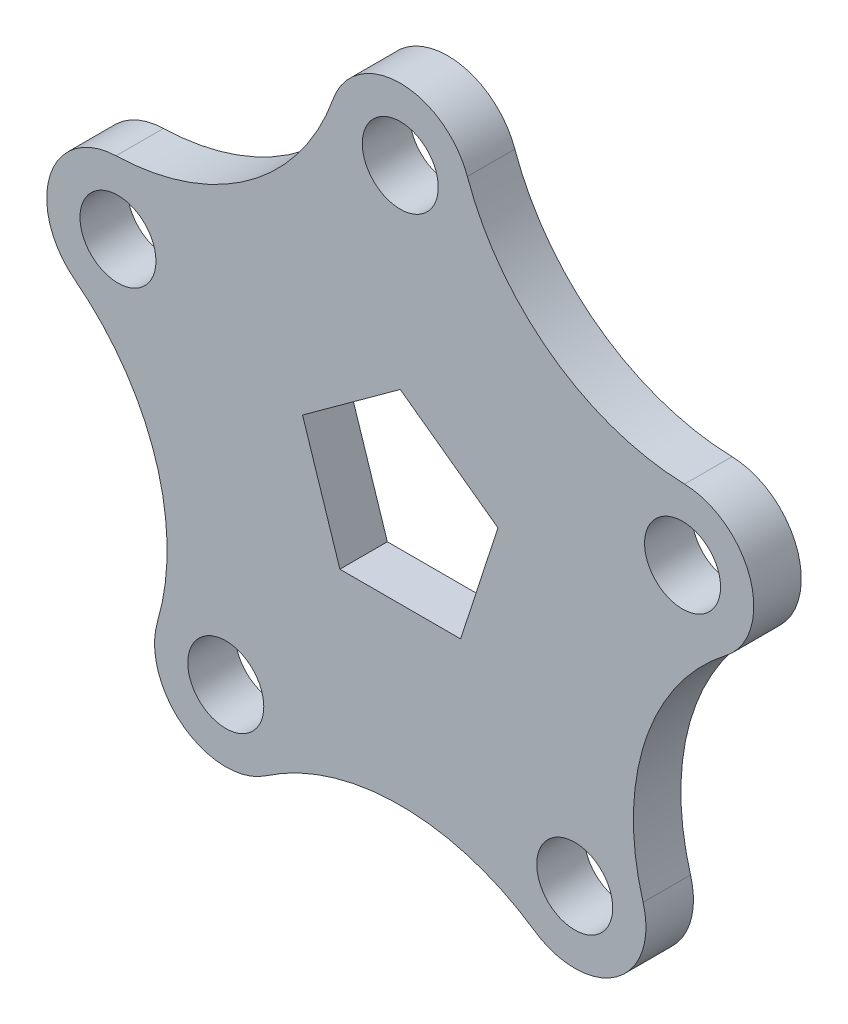
ISO-10303-21;
HEADER;
FILE_DESCRIPTION(('STEP AP214'),'2;1');
FILE_NAME('part.step','',(''),(''),'','','');
FILE_SCHEMA(('AUTOMOTIVE_DESIGN { 1 0 10303 214 1 1 1 1 }'));
ENDSEC;
DATA;
#1=APPLICATION_CONTEXT('core data for automotive mechanical design processes');
#2=APPLICATION_PROTOCOL_DEFINITION('international standard','automotive_design',2000,#1);
#3=PRODUCT_CONTEXT('',#1,'mechanical');
#4=PRODUCT('Part','Part','',(#3));
#5=PRODUCT_RELATED_PRODUCT_CATEGORY('part','',(#4));
#6=PRODUCT_DEFINITION_FORMATION('','',#4);
#7=PRODUCT_DEFINITION_CONTEXT('part definition',#1,'design');
#8=PRODUCT_DEFINITION('design','',#6,#7);
#9=PRODUCT_DEFINITION_SHAPE('','',#8);
#10=(LENGTH_UNIT() NAMED_UNIT(*) SI_UNIT(.MILLI.,.METRE.));
#11=(NAMED_UNIT(*) PLANE_ANGLE_UNIT() SI_UNIT($,.RADIAN.));
#12=(NAMED_UNIT(*) SI_UNIT($,.STERADIAN.) SOLID_ANGLE_UNIT());
#13=UNCERTAINTY_MEASURE_WITH_UNIT(LENGTH_MEASURE(1.E-05),#10,'distance_accuracy_value','');
#14=(GEOMETRIC_REPRESENTATION_CONTEXT(3) GLOBAL_UNCERTAINTY_ASSIGNED_CONTEXT((#13)) GLOBAL_UNIT_ASSIGNED_CONTEXT((#10,
#11,#12)) REPRESENTATION_CONTEXT('',''));
#15=CARTESIAN_POINT('',(0.,0.,0.));
#16=DIRECTION('',(0.,0.,1.));
#17=DIRECTION('',(1.,0.,0.));
#18=AXIS2_PLACEMENT_3D('',#15,#16,#17);
#19=CARTESIAN_POINT('',(10.2862419151183,14.1577974015616,10.));
#20=DIRECTION('',(-0.587785252292473,-0.809016994374948,0.));
#21=DIRECTION('',(0.809016994374948,-0.587785252292473,0.));
#22=AXIS2_PLACEMENT_3D('',#19,#20,#21);
#23=PLANE('',#22);
#24=DIRECTION('',(-0.809016994374948,0.587785252292473,0.));
#25=VECTOR('',#24,1.);
#26=CARTESIAN_POINT('',(10.2862419151183,14.1577974015616,0.));
#27=LINE('',#26,#25);
#28=CARTESIAN_POINT('',(20.5724838302366,6.68440519687684,0.));
#29=VERTEX_POINT('',#28);
#30=CARTESIAN_POINT('',(0.,21.6311896062463,0.));
#31=VERTEX_POINT('',#30);
#32=EDGE_CURVE('E252',#29,#31,#27,.T.);
#33=ORIENTED_EDGE('',*,*,#32,.F.);
#34=DIRECTION('',(0.,0.,-1.));
#35=VECTOR('',#34,1.);
#36=CARTESIAN_POINT('',(20.5724838302366,6.68440519687684,10.));
#37=LINE('',#36,#35);
#38=CARTESIAN_POINT('',(20.5724838302366,6.68440519687684,10.));
#39=VERTEX_POINT('',#38);
#40=EDGE_CURVE('E11',#39,#29,#37,.T.);
#41=ORIENTED_EDGE('',*,*,#40,.F.);
#42=DIRECTION('',(-0.809016994374948,0.587785252292473,0.));
#43=VECTOR('',#42,1.);
#44=CARTESIAN_POINT('',(10.2862419151183,14.1577974015616,10.));
#45=LINE('',#44,#43);
#46=CARTESIAN_POINT('',(0.,21.6311896062463,10.));
#47=VERTEX_POINT('',#46);
#48=EDGE_CURVE('E399',#39,#47,#45,.T.);
#49=ORIENTED_EDGE('',*,*,#48,.T.);
#50=DIRECTION('',(0.,0.,-1.));
#51=VECTOR('',#50,1.);
#52=CARTESIAN_POINT('',(0.,21.6311896062463,10.));
#53=LINE('',#52,#51);
#54=EDGE_CURVE('E65',#47,#31,#53,.T.);
#55=ORIENTED_EDGE('',*,*,#54,.T.);
#56=EDGE_LOOP('',(#33,#41,#49,#55));
#57=FACE_BOUND('',#56,.T.);
#58=ADVANCED_FACE('F45',(#57),#23,.T.);
#59=CARTESIAN_POINT('',(16.6434890351652,-5.40779740156158,10.));
#60=DIRECTION('',(-0.951056516295154,0.309016994374948,0.));
#61=DIRECTION('',(-0.309016994374948,-0.951056516295154,0.));
#62=AXIS2_PLACEMENT_3D('',#59,#60,#61);
#63=PLANE('',#62);
#64=DIRECTION('',(0.309016994374948,0.951056516295154,0.));
#65=VECTOR('',#64,1.);
#66=CARTESIAN_POINT('',(16.6434890351652,-5.40779740156158,0.));
#67=LINE('',#66,#65);
#68=CARTESIAN_POINT('',(12.7144942400938,-17.5,0.));
#69=VERTEX_POINT('',#68);
#70=EDGE_CURVE('E255',#69,#29,#67,.T.);
#71=ORIENTED_EDGE('',*,*,#70,.F.);
#72=DIRECTION('',(0.,0.,-1.));
#73=VECTOR('',#72,1.);
#74=CARTESIAN_POINT('',(12.7144942400938,-17.5,10.));
#75=LINE('',#74,#73);
#76=CARTESIAN_POINT('',(12.7144942400938,-17.5,10.));
#77=VERTEX_POINT('',#76);
#78=EDGE_CURVE('E56',#77,#69,#75,.T.);
#79=ORIENTED_EDGE('',*,*,#78,.F.);
#80=DIRECTION('',(0.309016994374948,0.951056516295154,0.));
#81=VECTOR('',#80,1.);
#82=CARTESIAN_POINT('',(16.6434890351652,-5.40779740156158,10.));
#83=LINE('',#82,#81);
#84=EDGE_CURVE('E180',#77,#39,#83,.T.);
#85=ORIENTED_EDGE('',*,*,#84,.T.);
#86=ORIENTED_EDGE('',*,*,#40,.T.);
#87=EDGE_LOOP('',(#71,#79,#85,#86));
#88=FACE_BOUND('',#87,.T.);
#89=ADVANCED_FACE('F404',(#88),#63,.T.);
#90=CARTESIAN_POINT('',(0.,-17.5,10.));
#91=DIRECTION('',(0.,1.,0.));
#92=DIRECTION('',(-1.,0.,0.));
#93=AXIS2_PLACEMENT_3D('',#90,#91,#92);
#94=PLANE('',#93);
#95=DIRECTION('',(1.,0.,0.));
#96=VECTOR('',#95,1.);
#97=CARTESIAN_POINT('',(0.,-17.5,0.));
#98=LINE('',#97,#96);
#99=CARTESIAN_POINT('',(-12.7144942400938,-17.5,0.));
#100=VERTEX_POINT('',#99);
#101=EDGE_CURVE('E165',#100,#69,#98,.T.);
#102=ORIENTED_EDGE('',*,*,#101,.F.);
#103=DIRECTION('',(0.,0.,-1.));
#104=VECTOR('',#103,1.);
#105=CARTESIAN_POINT('',(-12.7144942400938,-17.5,10.));
#106=LINE('',#105,#104);
#107=CARTESIAN_POINT('',(-12.7144942400938,-17.5,10.));
#108=VERTEX_POINT('',#107);
#109=EDGE_CURVE('E160',#108,#100,#106,.T.);
#110=ORIENTED_EDGE('',*,*,#109,.F.);
#111=DIRECTION('',(1.,0.,0.));
#112=VECTOR('',#111,1.);
#113=CARTESIAN_POINT('',(0.,-17.5,10.));
#114=LINE('',#113,#112);
#115=EDGE_CURVE('E163',#108,#77,#114,.T.);
#116=ORIENTED_EDGE('',*,*,#115,.T.);
#117=ORIENTED_EDGE('',*,*,#78,.T.);
#118=EDGE_LOOP('',(#102,#110,#116,#117));
#119=FACE_BOUND('',#118,.T.);
#120=ADVANCED_FACE('F162',(#119),#94,.T.);
#121=CARTESIAN_POINT('',(-16.6434890351652,-5.40779740156159,10.));
#122=DIRECTION('',(0.951056516295154,0.309016994374948,0.));
#123=DIRECTION('',(-0.309016994374948,0.951056516295154,0.));
#124=AXIS2_PLACEMENT_3D('',#121,#122,#123);
#125=PLANE('',#124);
#126=DIRECTION('',(0.309016994374948,-0.951056516295154,0.));
#127=VECTOR('',#126,1.);
#128=CARTESIAN_POINT('',(-16.6434890351652,-5.40779740156159,0.));
#129=LINE('',#128,#127);
#130=CARTESIAN_POINT('',(-20.5724838302366,6.68440519687683,0.));
#131=VERTEX_POINT('',#130);
#132=EDGE_CURVE('E261',#131,#100,#129,.T.);
#133=ORIENTED_EDGE('',*,*,#132,.F.);
#134=DIRECTION('',(0.,0.,-1.));
#135=VECTOR('',#134,1.);
#136=CARTESIAN_POINT('',(-20.5724838302366,6.68440519687683,10.));
#137=LINE('',#136,#135);
#138=CARTESIAN_POINT('',(-20.5724838302366,6.68440519687683,10.));
#139=VERTEX_POINT('',#138);
#140=EDGE_CURVE('E111',#139,#131,#137,.T.);
#141=ORIENTED_EDGE('',*,*,#140,.F.);
#142=DIRECTION('',(0.309016994374948,-0.951056516295154,0.));
#143=VECTOR('',#142,1.);
#144=CARTESIAN_POINT('',(-16.6434890351652,-5.40779740156159,10.));
#145=LINE('',#144,#143);
#146=EDGE_CURVE('E178',#139,#108,#145,.T.);
#147=ORIENTED_EDGE('',*,*,#146,.T.);
#148=ORIENTED_EDGE('',*,*,#109,.T.);
#149=EDGE_LOOP('',(#133,#141,#147,#148));
#150=FACE_BOUND('',#149,.T.);
#151=ADVANCED_FACE('F183',(#150),#125,.T.);
#152=CARTESIAN_POINT('',(-61.2393120472351,84.288681923909,10.));
#153=DIRECTION('',(0.,0.,-1.));
#154=DIRECTION('',(-1.,0.,0.));
#155=AXIS2_PLACEMENT_3D('',#152,#153,#154);
#156=CYLINDRICAL_SURFACE('',#155,49.9999999999997);
#157=CARTESIAN_POINT('',(-61.2393120472351,84.288681923909,0.));
#158=DIRECTION('',(0.,0.,1.));
#159=DIRECTION('',(1.,0.,0.));
#160=AXIS2_PLACEMENT_3D('',#157,#158,#159);
#161=CIRCLE('',#160,49.9999999999997);
#162=CARTESIAN_POINT('',(-59.8560199097057,34.3078205581597,0.));
#163=VERTEX_POINT('',#162);
#164=CARTESIAN_POINT('',(-14.1321489339774,67.5281573670559,0.));
#165=VERTEX_POINT('',#164);
#166=EDGE_CURVE('E196',#163,#165,#161,.T.);
#167=ORIENTED_EDGE('',*,*,#166,.F.);
#168=DIRECTION('',(0.,0.,-1.));
#169=VECTOR('',#168,1.);
#170=CARTESIAN_POINT('',(-59.8560199097057,34.3078205581597,10.));
#171=LINE('',#170,#169);
#172=CARTESIAN_POINT('',(-59.8560199097057,34.3078205581597,10.));
#173=VERTEX_POINT('',#172);
#174=EDGE_CURVE('E49',#173,#163,#171,.T.);
#175=ORIENTED_EDGE('',*,*,#174,.F.);
#176=CARTESIAN_POINT('',(-61.2393120472351,84.288681923909,10.));
#177=DIRECTION('',(0.,0.,1.));
#178=DIRECTION('',(1.,0.,0.));
#179=AXIS2_PLACEMENT_3D('',#176,#177,#178);
#180=CIRCLE('',#179,49.9999999999997);
#181=CARTESIAN_POINT('',(-14.1321489339774,67.5281573670559,10.));
#182=VERTEX_POINT('',#181);
#183=EDGE_CURVE('E272',#173,#182,#180,.T.);
#184=ORIENTED_EDGE('',*,*,#183,.T.);
#185=DIRECTION('',(0.,0.,-1.));
#186=VECTOR('',#185,1.);
#187=CARTESIAN_POINT('',(-14.1321489339774,67.5281573670559,10.));
#188=LINE('',#187,#186);
#189=EDGE_CURVE('E195',#182,#165,#188,.T.);
#190=ORIENTED_EDGE('',*,*,#189,.T.);
#191=EDGE_LOOP('',(#167,#175,#184,#190));
#192=FACE_BOUND('',#191,.T.);
#193=ADVANCED_FACE('F47',(#192),#156,.F.);
#194=CARTESIAN_POINT('',(-59.4410322684469,19.3135621484349,10.));
#195=DIRECTION('',(0.,0.,-1.));
#196=DIRECTION('',(-1.,0.,0.));
#197=AXIS2_PLACEMENT_3D('',#194,#195,#196);
#198=CYLINDRICAL_SURFACE('',#197,15.);
#199=CARTESIAN_POINT('',(-59.4410322684469,19.3135621484349,0.));
#200=DIRECTION('',(0.,0.,1.));
#201=DIRECTION('',(1.,0.,0.));
#202=AXIS2_PLACEMENT_3D('',#199,#200,#201);
#203=CIRCLE('',#202,15.);
#204=CARTESIAN_POINT('',(-68.5901682849797,7.4268758923338,0.));
#205=VERTEX_POINT('',#204);
#206=EDGE_CURVE('E200',#163,#205,#203,.T.);
#207=ORIENTED_EDGE('',*,*,#206,.T.);
#208=DIRECTION('',(0.,0.,-1.));
#209=VECTOR('',#208,1.);
#210=CARTESIAN_POINT('',(-68.5901682849797,7.4268758923338,10.));
#211=LINE('',#210,#209);
#212=CARTESIAN_POINT('',(-68.5901682849797,7.4268758923338,10.));
#213=VERTEX_POINT('',#212);
#214=EDGE_CURVE('E301',#213,#205,#211,.T.);
#215=ORIENTED_EDGE('',*,*,#214,.F.);
#216=CARTESIAN_POINT('',(-59.4410322684469,19.3135621484349,10.));
#217=DIRECTION('',(0.,0.,1.));
#218=DIRECTION('',(1.,0.,0.));
#219=AXIS2_PLACEMENT_3D('',#216,#217,#218);
#220=CIRCLE('',#219,15.);
#221=EDGE_CURVE('E311',#173,#213,#220,.T.);
#222=ORIENTED_EDGE('',*,*,#221,.F.);
#223=ORIENTED_EDGE('',*,*,#174,.T.);
#224=EDGE_LOOP('',(#207,#215,#222,#223));
#225=FACE_BOUND('',#224,.T.);
#226=ADVANCED_FACE('F310',(#225),#198,.T.);
#227=CARTESIAN_POINT('',(-99.0872883400892,-32.1954116280032,10.));
#228=DIRECTION('',(0.,0.,-1.));
#229=DIRECTION('',(-1.,0.,0.));
#230=AXIS2_PLACEMENT_3D('',#227,#228,#229);
#231=CYLINDRICAL_SURFACE('',#230,50.0000000000001);
#232=CARTESIAN_POINT('',(-99.0872883400892,-32.1954116280032,0.));
#233=DIRECTION('',(0.,0.,1.));
#234=DIRECTION('',(1.,0.,0.));
#235=AXIS2_PLACEMENT_3D('',#232,#233,#234);
#236=CIRCLE('',#235,50.0000000000001);
#237=CARTESIAN_POINT('',(-51.1252036694668,-46.3247581821807,0.));
#238=VERTEX_POINT('',#237);
#239=EDGE_CURVE('E204',#238,#205,#236,.T.);
#240=ORIENTED_EDGE('',*,*,#239,.F.);
#241=DIRECTION('',(0.,0.,-1.));
#242=VECTOR('',#241,1.);
#243=CARTESIAN_POINT('',(-51.1252036694668,-46.3247581821807,10.));
#244=LINE('',#243,#242);
#245=CARTESIAN_POINT('',(-51.1252036694668,-46.3247581821807,10.));
#246=VERTEX_POINT('',#245);
#247=EDGE_CURVE('E299',#246,#238,#244,.T.);
#248=ORIENTED_EDGE('',*,*,#247,.F.);
#249=CARTESIAN_POINT('',(-99.0872883400892,-32.1954116280032,10.));
#250=DIRECTION('',(0.,0.,1.));
#251=DIRECTION('',(1.,0.,0.));
#252=AXIS2_PLACEMENT_3D('',#249,#250,#251);
#253=CIRCLE('',#252,50.0000000000001);
#254=EDGE_CURVE('E356',#246,#213,#253,.T.);
#255=ORIENTED_EDGE('',*,*,#254,.T.);
#256=ORIENTED_EDGE('',*,*,#214,.T.);
#257=EDGE_LOOP('',(#240,#248,#255,#256));
#258=FACE_BOUND('',#257,.T.);
#259=ADVANCED_FACE('F354',(#258),#231,.F.);
#260=CARTESIAN_POINT('',(-36.73657826828,-50.5635621484339,10.));
#261=DIRECTION('',(0.,0.,-1.));
#262=DIRECTION('',(-1.,0.,0.));
#263=AXIS2_PLACEMENT_3D('',#260,#261,#262);
#264=CYLINDRICAL_SURFACE('',#263,15.);
#265=CARTESIAN_POINT('',(-36.73657826828,-50.5635621484339,0.));
#266=DIRECTION('',(0.,0.,1.));
#267=DIRECTION('',(1.,0.,0.));
#268=AXIS2_PLACEMENT_3D('',#265,#266,#267);
#269=CIRCLE('',#268,15.);
#270=CARTESIAN_POINT('',(-28.2589063602156,-62.9380956353665,0.));
#271=VERTEX_POINT('',#270);
#272=EDGE_CURVE('E208',#238,#271,#269,.T.);
#273=ORIENTED_EDGE('',*,*,#272,.T.);
#274=DIRECTION('',(0.,0.,-1.));
#275=VECTOR('',#274,1.);
#276=CARTESIAN_POINT('',(-28.2589063602156,-62.9380956353665,10.));
#277=LINE('',#276,#275);
#278=CARTESIAN_POINT('',(-28.2589063602156,-62.9380956353665,10.));
#279=VERTEX_POINT('',#278);
#280=EDGE_CURVE('E296',#279,#271,#277,.T.);
#281=ORIENTED_EDGE('',*,*,#280,.F.);
#282=CARTESIAN_POINT('',(-36.73657826828,-50.5635621484339,10.));
#283=DIRECTION('',(0.,0.,1.));
#284=DIRECTION('',(1.,0.,0.));
#285=AXIS2_PLACEMENT_3D('',#282,#283,#284);
#286=CIRCLE('',#285,15.);
#287=EDGE_CURVE('E357',#246,#279,#286,.T.);
#288=ORIENTED_EDGE('',*,*,#287,.F.);
#289=ORIENTED_EDGE('',*,*,#247,.T.);
#290=EDGE_LOOP('',(#273,#281,#288,#289));
#291=FACE_BOUND('',#290,.T.);
#292=ADVANCED_FACE('F353',(#291),#264,.T.);
#293=CARTESIAN_POINT('',(-6.03683769639929E-13,-104.186540591808,10.));
#294=DIRECTION('',(0.,0.,-1.));
#295=DIRECTION('',(-1.,0.,0.));
#296=AXIS2_PLACEMENT_3D('',#293,#294,#295);
#297=CYLINDRICAL_SURFACE('',#296,50.0000000000001);
#298=CARTESIAN_POINT('',(-6.03683769639929E-13,-104.186540591808,0.));
#299=DIRECTION('',(0.,0.,1.));
#300=DIRECTION('',(1.,0.,0.));
#301=AXIS2_PLACEMENT_3D('',#298,#299,#300);
#302=CIRCLE('',#301,50.0000000000001);
#303=CARTESIAN_POINT('',(28.2589063602147,-62.9380956353669,0.));
#304=VERTEX_POINT('',#303);
#305=EDGE_CURVE('E212',#304,#271,#302,.T.);
#306=ORIENTED_EDGE('',*,*,#305,.F.);
#307=DIRECTION('',(0.,0.,-1.));
#308=VECTOR('',#307,1.);
#309=CARTESIAN_POINT('',(28.2589063602147,-62.9380956353669,10.));
#310=LINE('',#309,#308);
#311=CARTESIAN_POINT('',(28.2589063602147,-62.9380956353669,10.));
#312=VERTEX_POINT('',#311);
#313=EDGE_CURVE('E293',#312,#304,#310,.T.);
#314=ORIENTED_EDGE('',*,*,#313,.F.);
#315=CARTESIAN_POINT('',(-6.03683769639929E-13,-104.186540591808,10.));
#316=DIRECTION('',(0.,0.,1.));
#317=DIRECTION('',(1.,0.,0.));
#318=AXIS2_PLACEMENT_3D('',#315,#316,#317);
#319=CIRCLE('',#318,50.0000000000001);
#320=EDGE_CURVE('E350',#312,#279,#319,.T.);
#321=ORIENTED_EDGE('',*,*,#320,.T.);
#322=ORIENTED_EDGE('',*,*,#280,.T.);
#323=EDGE_LOOP('',(#306,#314,#321,#322));
#324=FACE_BOUND('',#323,.T.);
#325=ADVANCED_FACE('F346',(#324),#297,.F.);
#326=CARTESIAN_POINT('',(36.7365782682793,-50.5635621484344,10.));
#327=DIRECTION('',(0.,0.,-1.));
#328=DIRECTION('',(-1.,0.,0.));
#329=AXIS2_PLACEMENT_3D('',#326,#327,#328);
#330=CYLINDRICAL_SURFACE('',#329,15.);
#331=CARTESIAN_POINT('',(36.7365782682793,-50.5635621484344,0.));
#332=DIRECTION('',(0.,0.,1.));
#333=DIRECTION('',(1.,0.,0.));
#334=AXIS2_PLACEMENT_3D('',#331,#332,#333);
#335=CIRCLE('',#334,15.);
#336=CARTESIAN_POINT('',(51.1252036694661,-46.3247581821813,0.));
#337=VERTEX_POINT('',#336);
#338=EDGE_CURVE('E216',#304,#337,#335,.T.);
#339=ORIENTED_EDGE('',*,*,#338,.T.);
#340=DIRECTION('',(0.,0.,-1.));
#341=VECTOR('',#340,1.);
#342=CARTESIAN_POINT('',(51.1252036694661,-46.3247581821813,10.));
#343=LINE('',#342,#341);
#344=CARTESIAN_POINT('',(51.1252036694661,-46.3247581821813,10.));
#345=VERTEX_POINT('',#344);
#346=EDGE_CURVE('E290',#345,#337,#343,.T.);
#347=ORIENTED_EDGE('',*,*,#346,.F.);
#348=CARTESIAN_POINT('',(36.7365782682793,-50.5635621484344,10.));
#349=DIRECTION('',(0.,0.,1.));
#350=DIRECTION('',(1.,0.,0.));
#351=AXIS2_PLACEMENT_3D('',#348,#349,#350);
#352=CIRCLE('',#351,15.);
#353=EDGE_CURVE('E370',#312,#345,#352,.T.);
#354=ORIENTED_EDGE('',*,*,#353,.F.);
#355=ORIENTED_EDGE('',*,*,#313,.T.);
#356=EDGE_LOOP('',(#339,#347,#354,#355));
#357=FACE_BOUND('',#356,.T.);
#358=ADVANCED_FACE('F343',(#357),#330,.T.);
#359=CARTESIAN_POINT('',(99.0872883400888,-32.1954116280044,10.));
#360=DIRECTION('',(0.,0.,-1.));
#361=DIRECTION('',(-1.,0.,0.));
#362=AXIS2_PLACEMENT_3D('',#359,#360,#361);
#363=CYLINDRICAL_SURFACE('',#362,50.0000000000001);
#364=CARTESIAN_POINT('',(99.0872883400888,-32.1954116280044,0.));
#365=DIRECTION('',(0.,0.,1.));
#366=DIRECTION('',(1.,0.,0.));
#367=AXIS2_PLACEMENT_3D('',#364,#365,#366);
#368=CIRCLE('',#367,50.0000000000001);
#369=CARTESIAN_POINT('',(68.5901682849799,7.42687589233287,0.));
#370=VERTEX_POINT('',#369);
#371=EDGE_CURVE('E220',#370,#337,#368,.T.);
#372=ORIENTED_EDGE('',*,*,#371,.F.);
#373=DIRECTION('',(0.,0.,-1.));
#374=VECTOR('',#373,1.);
#375=CARTESIAN_POINT('',(68.5901682849799,7.42687589233287,10.));
#376=LINE('',#375,#374);
#377=CARTESIAN_POINT('',(68.5901682849799,7.42687589233287,10.));
#378=VERTEX_POINT('',#377);
#379=EDGE_CURVE('E287',#378,#370,#376,.T.);
#380=ORIENTED_EDGE('',*,*,#379,.F.);
#381=CARTESIAN_POINT('',(99.0872883400888,-32.1954116280044,10.));
#382=DIRECTION('',(0.,0.,1.));
#383=DIRECTION('',(1.,0.,0.));
#384=AXIS2_PLACEMENT_3D('',#381,#382,#383);
#385=CIRCLE('',#384,50.0000000000001);
#386=EDGE_CURVE('E340',#378,#345,#385,.T.);
#387=ORIENTED_EDGE('',*,*,#386,.T.);
#388=ORIENTED_EDGE('',*,*,#346,.T.);
#389=EDGE_LOOP('',(#372,#380,#387,#388));
#390=FACE_BOUND('',#389,.T.);
#391=ADVANCED_FACE('F336',(#390),#363,.F.);
#392=CARTESIAN_POINT('',(59.4410322684472,19.313562148434,10.));
#393=DIRECTION('',(0.,0.,-1.));
#394=DIRECTION('',(-1.,0.,0.));
#395=AXIS2_PLACEMENT_3D('',#392,#393,#394);
#396=CYLINDRICAL_SURFACE('',#395,15.);
#397=CARTESIAN_POINT('',(59.4410322684472,19.313562148434,0.));
#398=DIRECTION('',(0.,0.,1.));
#399=DIRECTION('',(1.,0.,0.));
#400=AXIS2_PLACEMENT_3D('',#397,#398,#399);
#401=CIRCLE('',#400,15.);
#402=CARTESIAN_POINT('',(59.8560199097061,34.3078205581589,0.));
#403=VERTEX_POINT('',#402);
#404=EDGE_CURVE('E224',#370,#403,#401,.T.);
#405=ORIENTED_EDGE('',*,*,#404,.T.);
#406=DIRECTION('',(0.,0.,-1.));
#407=VECTOR('',#406,1.);
#408=CARTESIAN_POINT('',(59.8560199097061,34.3078205581589,10.));
#409=LINE('',#408,#407);
#410=CARTESIAN_POINT('',(59.8560199097061,34.3078205581589,10.));
#411=VERTEX_POINT('',#410);
#412=EDGE_CURVE('E284',#411,#403,#409,.T.);
#413=ORIENTED_EDGE('',*,*,#412,.F.);
#414=CARTESIAN_POINT('',(59.4410322684472,19.313562148434,10.));
#415=DIRECTION('',(0.,0.,1.));
#416=DIRECTION('',(1.,0.,0.));
#417=AXIS2_PLACEMENT_3D('',#414,#415,#416);
#418=CIRCLE('',#417,15.);
#419=EDGE_CURVE('E375',#378,#411,#418,.T.);
#420=ORIENTED_EDGE('',*,*,#419,.F.);
#421=ORIENTED_EDGE('',*,*,#379,.T.);
#422=EDGE_LOOP('',(#405,#413,#420,#421));
#423=FACE_BOUND('',#422,.T.);
#424=ADVANCED_FACE('F332',(#423),#396,.T.);
#425=CARTESIAN_POINT('',(61.2393120472361,84.2886819239083,10.));
#426=DIRECTION('',(0.,0.,-1.));
#427=DIRECTION('',(-1.,0.,0.));
#428=AXIS2_PLACEMENT_3D('',#425,#426,#427);
#429=CYLINDRICAL_SURFACE('',#428,50.0000000000001);
#430=CARTESIAN_POINT('',(61.2393120472361,84.2886819239083,0.));
#431=DIRECTION('',(0.,0.,1.));
#432=DIRECTION('',(1.,0.,0.));
#433=AXIS2_PLACEMENT_3D('',#430,#431,#432);
#434=CIRCLE('',#433,50.0000000000001);
#435=CARTESIAN_POINT('',(14.1321489339775,67.5281573670558,0.));
#436=VERTEX_POINT('',#435);
#437=EDGE_CURVE('E228',#436,#403,#434,.T.);
#438=ORIENTED_EDGE('',*,*,#437,.F.);
#439=DIRECTION('',(0.,0.,-1.));
#440=VECTOR('',#439,1.);
#441=CARTESIAN_POINT('',(14.1321489339775,67.5281573670558,10.));
#442=LINE('',#441,#440);
#443=CARTESIAN_POINT('',(14.1321489339775,67.5281573670558,10.));
#444=VERTEX_POINT('',#443);
#445=EDGE_CURVE('E281',#444,#436,#442,.T.);
#446=ORIENTED_EDGE('',*,*,#445,.F.);
#447=CARTESIAN_POINT('',(61.2393120472361,84.2886819239083,10.));
#448=DIRECTION('',(0.,0.,1.));
#449=DIRECTION('',(1.,0.,0.));
#450=AXIS2_PLACEMENT_3D('',#447,#448,#449);
#451=CIRCLE('',#450,50.0000000000001);
#452=EDGE_CURVE('E329',#444,#411,#451,.T.);
#453=ORIENTED_EDGE('',*,*,#452,.T.);
#454=ORIENTED_EDGE('',*,*,#412,.T.);
#455=EDGE_LOOP('',(#438,#446,#453,#454));
#456=FACE_BOUND('',#455,.T.);
#457=ADVANCED_FACE('F325',(#456),#429,.F.);
#458=CARTESIAN_POINT('',(-10.2862419151183,14.1577974015616,10.));
#459=DIRECTION('',(0.587785252292473,-0.809016994374947,0.));
#460=DIRECTION('',(0.809016994374947,0.587785252292473,0.));
#461=AXIS2_PLACEMENT_3D('',#458,#459,#460);
#462=PLANE('',#461);
#463=DIRECTION('',(-0.809016994374947,-0.587785252292473,0.));
#464=VECTOR('',#463,1.);
#465=CARTESIAN_POINT('',(-10.2862419151183,14.1577974015616,0.));
#466=LINE('',#465,#464);
#467=EDGE_CURVE('E264',#31,#131,#466,.T.);
#468=ORIENTED_EDGE('',*,*,#467,.F.);
#469=ORIENTED_EDGE('',*,*,#54,.F.);
#470=DIRECTION('',(-0.809016994374947,-0.587785252292473,0.));
#471=VECTOR('',#470,1.);
#472=CARTESIAN_POINT('',(-10.2862419151183,14.1577974015616,10.));
#473=LINE('',#472,#471);
#474=EDGE_CURVE('E185',#47,#139,#473,.T.);
#475=ORIENTED_EDGE('',*,*,#474,.T.);
#476=ORIENTED_EDGE('',*,*,#140,.T.);
#477=EDGE_LOOP('',(#468,#469,#475,#476));
#478=FACE_BOUND('',#477,.T.);
#479=ADVANCED_FACE('F407',(#478),#462,.T.);
#480=CARTESIAN_POINT('',(0.,62.5,10.));
#481=DIRECTION('',(0.,0.,-1.));
#482=DIRECTION('',(-1.,0.,0.));
#483=AXIS2_PLACEMENT_3D('',#480,#481,#482);
#484=CYLINDRICAL_SURFACE('',#483,8.);
#485=CARTESIAN_POINT('',(0.,62.5,10.));
#486=DIRECTION('',(0.,0.,1.));
#487=DIRECTION('',(1.,0.,0.));
#488=AXIS2_PLACEMENT_3D('',#485,#486,#487);
#489=CIRCLE('',#488,8.);
#490=CARTESIAN_POINT('',(8.,62.5,10.));
#491=VERTEX_POINT('',#490);
#492=EDGE_CURVE('E395',#491,#491,#489,.T.);
#493=ORIENTED_EDGE('',*,*,#492,.T.);
#494=EDGE_LOOP('',(#493));
#495=FACE_BOUND('',#494,.T.);
#496=CARTESIAN_POINT('',(0.,62.5,0.));
#497=DIRECTION('',(0.,0.,1.));
#498=DIRECTION('',(1.,0.,0.));
#499=AXIS2_PLACEMENT_3D('',#496,#497,#498);
#500=CIRCLE('',#499,8.);
#501=CARTESIAN_POINT('',(8.,62.5,0.));
#502=VERTEX_POINT('',#501);
#503=EDGE_CURVE('E248',#502,#502,#500,.T.);
#504=ORIENTED_EDGE('',*,*,#503,.F.);
#505=EDGE_LOOP('',(#504));
#506=FACE_BOUND('',#505,.T.);
#507=ADVANCED_FACE('F409',(#495,#506),#484,.F.);
#508=CARTESIAN_POINT('',(36.7365782682796,-50.5635621484342,10.));
#509=DIRECTION('',(0.,0.,-1.));
#510=DIRECTION('',(-1.,0.,0.));
#511=AXIS2_PLACEMENT_3D('',#508,#509,#510);
#512=CYLINDRICAL_SURFACE('',#511,7.99999999999999);
#513=CARTESIAN_POINT('',(36.7365782682796,-50.5635621484342,10.));
#514=DIRECTION('',(0.,0.,1.));
#515=DIRECTION('',(1.,0.,0.));
#516=AXIS2_PLACEMENT_3D('',#513,#514,#515);
#517=CIRCLE('',#516,7.99999999999999);
#518=CARTESIAN_POINT('',(44.7365782682796,-50.5635621484342,10.));
#519=VERTEX_POINT('',#518);
#520=EDGE_CURVE('E391',#519,#519,#517,.T.);
#521=ORIENTED_EDGE('',*,*,#520,.T.);
#522=EDGE_LOOP('',(#521));
#523=FACE_BOUND('',#522,.T.);
#524=CARTESIAN_POINT('',(36.7365782682796,-50.5635621484342,0.));
#525=DIRECTION('',(0.,0.,1.));
#526=DIRECTION('',(1.,0.,0.));
#527=AXIS2_PLACEMENT_3D('',#524,#525,#526);
#528=CIRCLE('',#527,7.99999999999999);
#529=CARTESIAN_POINT('',(44.7365782682796,-50.5635621484342,0.));
#530=VERTEX_POINT('',#529);
#531=EDGE_CURVE('E244',#530,#530,#528,.T.);
#532=ORIENTED_EDGE('',*,*,#531,.F.);
#533=EDGE_LOOP('',(#532));
#534=FACE_BOUND('',#533,.T.);
#535=ADVANCED_FACE('F415',(#523,#534),#512,.F.);
#536=CARTESIAN_POINT('',(-36.7365782682796,-50.5635621484342,10.));
#537=DIRECTION('',(0.,0.,-1.));
#538=DIRECTION('',(-1.,0.,0.));
#539=AXIS2_PLACEMENT_3D('',#536,#537,#538);
#540=CYLINDRICAL_SURFACE('',#539,8.00000000000001);
#541=CARTESIAN_POINT('',(-36.7365782682796,-50.5635621484342,10.));
#542=DIRECTION('',(0.,0.,1.));
#543=DIRECTION('',(1.,0.,0.));
#544=AXIS2_PLACEMENT_3D('',#541,#542,#543);
#545=CIRCLE('',#544,8.00000000000001);
#546=CARTESIAN_POINT('',(-28.7365782682796,-50.5635621484342,10.));
#547=VERTEX_POINT('',#546);
#548=EDGE_CURVE('E387',#547,#547,#545,.T.);
#549=ORIENTED_EDGE('',*,*,#548,.T.);
#550=EDGE_LOOP('',(#549));
#551=FACE_BOUND('',#550,.T.);
#552=CARTESIAN_POINT('',(-36.7365782682796,-50.5635621484342,0.));
#553=DIRECTION('',(0.,0.,1.));
#554=DIRECTION('',(1.,0.,0.));
#555=AXIS2_PLACEMENT_3D('',#552,#553,#554);
#556=CIRCLE('',#555,8.00000000000001);
#557=CARTESIAN_POINT('',(-28.7365782682796,-50.5635621484342,0.));
#558=VERTEX_POINT('',#557);
#559=EDGE_CURVE('E240',#558,#558,#556,.T.);
#560=ORIENTED_EDGE('',*,*,#559,.F.);
#561=EDGE_LOOP('',(#560));
#562=FACE_BOUND('',#561,.T.);
#563=ADVANCED_FACE('F431',(#551,#562),#540,.F.);
#564=CARTESIAN_POINT('',(-59.4410322684471,19.3135621484342,10.));
#565=DIRECTION('',(0.,0.,-1.));
#566=DIRECTION('',(-1.,0.,0.));
#567=AXIS2_PLACEMENT_3D('',#564,#565,#566);
#568=CYLINDRICAL_SURFACE('',#567,8.);
#569=CARTESIAN_POINT('',(-59.4410322684471,19.3135621484342,10.));
#570=DIRECTION('',(0.,0.,1.));
#571=DIRECTION('',(1.,0.,0.));
#572=AXIS2_PLACEMENT_3D('',#569,#570,#571);
#573=CIRCLE('',#572,8.);
#574=CARTESIAN_POINT('',(-51.4410322684471,19.3135621484342,10.));
#575=VERTEX_POINT('',#574);
#576=EDGE_CURVE('E383',#575,#575,#573,.T.);
#577=ORIENTED_EDGE('',*,*,#576,.T.);
#578=EDGE_LOOP('',(#577));
#579=FACE_BOUND('',#578,.T.);
#580=CARTESIAN_POINT('',(-59.4410322684471,19.3135621484342,0.));
#581=DIRECTION('',(0.,0.,1.));
#582=DIRECTION('',(1.,0.,0.));
#583=AXIS2_PLACEMENT_3D('',#580,#581,#582);
#584=CIRCLE('',#583,8.);
#585=CARTESIAN_POINT('',(-51.4410322684471,19.3135621484342,0.));
#586=VERTEX_POINT('',#585);
#587=EDGE_CURVE('E236',#586,#586,#584,.T.);
#588=ORIENTED_EDGE('',*,*,#587,.F.);
#589=EDGE_LOOP('',(#588));
#590=FACE_BOUND('',#589,.T.);
#591=ADVANCED_FACE('F435',(#579,#590),#568,.F.);
#592=CARTESIAN_POINT('',(0.,62.5,10.));
#593=DIRECTION('',(0.,0.,-1.));
#594=DIRECTION('',(-1.,0.,0.));
#595=AXIS2_PLACEMENT_3D('',#592,#593,#594);
#596=CYLINDRICAL_SURFACE('',#595,14.9999999999999);
#597=CARTESIAN_POINT('',(0.,62.5,0.));
#598=DIRECTION('',(0.,0.,1.));
#599=DIRECTION('',(1.,0.,0.));
#600=AXIS2_PLACEMENT_3D('',#597,#598,#599);
#601=CIRCLE('',#600,14.9999999999999);
#602=EDGE_CURVE('E232',#436,#165,#601,.T.);
#603=ORIENTED_EDGE('',*,*,#602,.T.);
#604=ORIENTED_EDGE('',*,*,#189,.F.);
#605=CARTESIAN_POINT('',(0.,62.5,10.));
#606=DIRECTION('',(0.,0.,1.));
#607=DIRECTION('',(1.,0.,0.));
#608=AXIS2_PLACEMENT_3D('',#605,#606,#607);
#609=CIRCLE('',#608,14.9999999999999);
#610=EDGE_CURVE('E380',#444,#182,#609,.T.);
#611=ORIENTED_EDGE('',*,*,#610,.F.);
#612=ORIENTED_EDGE('',*,*,#445,.T.);
#613=EDGE_LOOP('',(#603,#604,#611,#612));
#614=FACE_BOUND('',#613,.T.);
#615=ADVANCED_FACE('F321',(#614),#596,.T.);
#616=CARTESIAN_POINT('',(59.4410322684472,19.313562148434,10.));
#617=DIRECTION('',(0.,0.,-1.));
#618=DIRECTION('',(-1.,0.,0.));
#619=AXIS2_PLACEMENT_3D('',#616,#617,#618);
#620=CYLINDRICAL_SURFACE('',#619,8.00000000000005);
#621=CARTESIAN_POINT('',(59.4410322684472,19.313562148434,10.));
#622=DIRECTION('',(0.,0.,1.));
#623=DIRECTION('',(1.,0.,0.));
#624=AXIS2_PLACEMENT_3D('',#621,#622,#623);
#625=CIRCLE('',#624,8.00000000000005);
#626=CARTESIAN_POINT('',(67.4410322684472,19.313562148434,10.));
#627=VERTEX_POINT('',#626);
#628=EDGE_CURVE('E188',#627,#627,#625,.T.);
#629=ORIENTED_EDGE('',*,*,#628,.T.);
#630=EDGE_LOOP('',(#629));
#631=FACE_BOUND('',#630,.T.);
#632=CARTESIAN_POINT('',(59.4410322684472,19.313562148434,0.));
#633=DIRECTION('',(0.,0.,1.));
#634=DIRECTION('',(1.,0.,0.));
#635=AXIS2_PLACEMENT_3D('',#632,#633,#634);
#636=CIRCLE('',#635,8.00000000000005);
#637=CARTESIAN_POINT('',(67.4410322684472,19.313562148434,0.));
#638=VERTEX_POINT('',#637);
#639=EDGE_CURVE('E268',#638,#638,#636,.T.);
#640=ORIENTED_EDGE('',*,*,#639,.F.);
#641=EDGE_LOOP('',(#640));
#642=FACE_BOUND('',#641,.T.);
#643=ADVANCED_FACE('F441',(#631,#642),#620,.F.);
#644=CARTESIAN_POINT('',(0.,0.,10.));
#645=DIRECTION('',(0.,0.,1.));
#646=DIRECTION('',(1.,0.,0.));
#647=AXIS2_PLACEMENT_3D('',#644,#645,#646);
#648=PLANE('',#647);
#649=ORIENTED_EDGE('',*,*,#183,.F.);
#650=ORIENTED_EDGE('',*,*,#221,.T.);
#651=ORIENTED_EDGE('',*,*,#254,.F.);
#652=ORIENTED_EDGE('',*,*,#287,.T.);
#653=ORIENTED_EDGE('',*,*,#320,.F.);
#654=ORIENTED_EDGE('',*,*,#353,.T.);
#655=ORIENTED_EDGE('',*,*,#386,.F.);
#656=ORIENTED_EDGE('',*,*,#419,.T.);
#657=ORIENTED_EDGE('',*,*,#452,.F.);
#658=ORIENTED_EDGE('',*,*,#610,.T.);
#659=EDGE_LOOP('',(#649,#650,#651,#652,#653,#654,#655,#656,#657,#658));
#660=FACE_BOUND('',#659,.T.);
#661=ORIENTED_EDGE('',*,*,#576,.F.);
#662=EDGE_LOOP('',(#661));
#663=FACE_BOUND('',#662,.T.);
#664=ORIENTED_EDGE('',*,*,#548,.F.);
#665=EDGE_LOOP('',(#664));
#666=FACE_BOUND('',#665,.T.);
#667=ORIENTED_EDGE('',*,*,#520,.F.);
#668=EDGE_LOOP('',(#667));
#669=FACE_BOUND('',#668,.T.);
#670=ORIENTED_EDGE('',*,*,#492,.F.);
#671=EDGE_LOOP('',(#670));
#672=FACE_BOUND('',#671,.T.);
#673=ORIENTED_EDGE('',*,*,#48,.F.);
#674=ORIENTED_EDGE('',*,*,#84,.F.);
#675=ORIENTED_EDGE('',*,*,#115,.F.);
#676=ORIENTED_EDGE('',*,*,#146,.F.);
#677=ORIENTED_EDGE('',*,*,#474,.F.);
#678=EDGE_LOOP('',(#673,#674,#675,#676,#677));
#679=FACE_BOUND('',#678,.T.);
#680=ORIENTED_EDGE('',*,*,#628,.F.);
#681=EDGE_LOOP('',(#680));
#682=FACE_BOUND('',#681,.T.);
#683=ADVANCED_FACE('F175',(#660,#663,#666,#669,#672,#679,#682),#648,.T.);
#684=CARTESIAN_POINT('',(0.,0.,0.));
#685=DIRECTION('',(0.,0.,1.));
#686=DIRECTION('',(1.,0.,0.));
#687=AXIS2_PLACEMENT_3D('',#684,#685,#686);
#688=PLANE('',#687);
#689=ORIENTED_EDGE('',*,*,#166,.T.);
#690=ORIENTED_EDGE('',*,*,#602,.F.);
#691=ORIENTED_EDGE('',*,*,#437,.T.);
#692=ORIENTED_EDGE('',*,*,#404,.F.);
#693=ORIENTED_EDGE('',*,*,#371,.T.);
#694=ORIENTED_EDGE('',*,*,#338,.F.);
#695=ORIENTED_EDGE('',*,*,#305,.T.);
#696=ORIENTED_EDGE('',*,*,#272,.F.);
#697=ORIENTED_EDGE('',*,*,#239,.T.);
#698=ORIENTED_EDGE('',*,*,#206,.F.);
#699=EDGE_LOOP('',(#689,#690,#691,#692,#693,#694,#695,#696,#697,#698));
#700=FACE_BOUND('',#699,.T.);
#701=ORIENTED_EDGE('',*,*,#587,.T.);
#702=EDGE_LOOP('',(#701));
#703=FACE_BOUND('',#702,.T.);
#704=ORIENTED_EDGE('',*,*,#559,.T.);
#705=EDGE_LOOP('',(#704));
#706=FACE_BOUND('',#705,.T.);
#707=ORIENTED_EDGE('',*,*,#531,.T.);
#708=EDGE_LOOP('',(#707));
#709=FACE_BOUND('',#708,.T.);
#710=ORIENTED_EDGE('',*,*,#503,.T.);
#711=EDGE_LOOP('',(#710));
#712=FACE_BOUND('',#711,.T.);
#713=ORIENTED_EDGE('',*,*,#32,.T.);
#714=ORIENTED_EDGE('',*,*,#467,.T.);
#715=ORIENTED_EDGE('',*,*,#132,.T.);
#716=ORIENTED_EDGE('',*,*,#101,.T.);
#717=ORIENTED_EDGE('',*,*,#70,.T.);
#718=EDGE_LOOP('',(#713,#714,#715,#716,#717));
#719=FACE_BOUND('',#718,.T.);
#720=ORIENTED_EDGE('',*,*,#639,.T.);
#721=EDGE_LOOP('',(#720));
#722=FACE_BOUND('',#721,.T.);
#723=ADVANCED_FACE('F314',(#700,#703,#706,#709,#712,#719,#722),#688,.F.);
#724=CLOSED_SHELL('',(#58,#89,#120,#151,#193,#226,#259,#292,#325,#358,#391,#424,#457,#479,#507,
#535,#563,#591,#615,#643,#683,#723));
#725=MANIFOLD_SOLID_BREP('B2',#724);
#726=ADVANCED_BREP_SHAPE_REPRESENTATION('',(#18,#725),#14);
#727=SHAPE_DEFINITION_REPRESENTATION(#9,#726);
ENDSEC;
END-ISO-10303-21;
